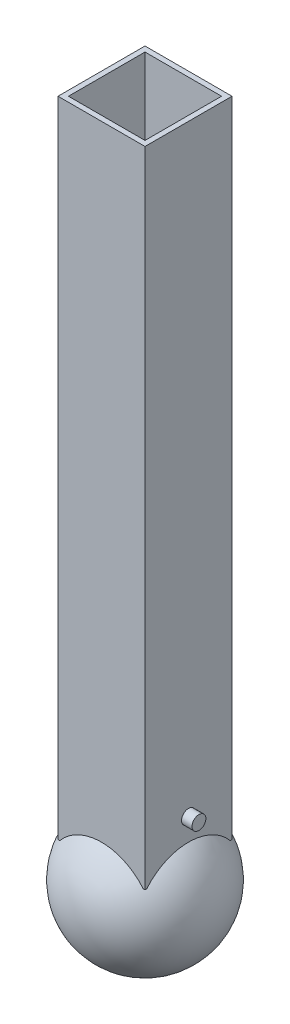
ISO-10303-21;
HEADER;
FILE_DESCRIPTION(('STEP AP214'),'2;1');
FILE_NAME('part.step','',(''),(''),'','','');
FILE_SCHEMA(('AUTOMOTIVE_DESIGN { 1 0 10303 214 1 1 1 1 }'));
ENDSEC;
DATA;
#1=APPLICATION_CONTEXT('core data for automotive mechanical design processes');
#2=APPLICATION_PROTOCOL_DEFINITION('international standard','automotive_design',2000,#1);
#3=PRODUCT_CONTEXT('',#1,'mechanical');
#4=PRODUCT('Part','Part','',(#3));
#5=PRODUCT_RELATED_PRODUCT_CATEGORY('part','',(#4));
#6=PRODUCT_DEFINITION_FORMATION('','',#4);
#7=PRODUCT_DEFINITION_CONTEXT('part definition',#1,'design');
#8=PRODUCT_DEFINITION('design','',#6,#7);
#9=PRODUCT_DEFINITION_SHAPE('','',#8);
#10=(LENGTH_UNIT() NAMED_UNIT(*) SI_UNIT(.MILLI.,.METRE.));
#11=(NAMED_UNIT(*) PLANE_ANGLE_UNIT() SI_UNIT($,.RADIAN.));
#12=(NAMED_UNIT(*) SI_UNIT($,.STERADIAN.) SOLID_ANGLE_UNIT());
#13=UNCERTAINTY_MEASURE_WITH_UNIT(LENGTH_MEASURE(1.E-05),#10,'distance_accuracy_value','');
#14=(GEOMETRIC_REPRESENTATION_CONTEXT(3) GLOBAL_UNCERTAINTY_ASSIGNED_CONTEXT((#13)) GLOBAL_UNIT_ASSIGNED_CONTEXT((#10,
#11,#12)) REPRESENTATION_CONTEXT('',''));
#15=CARTESIAN_POINT('',(0.,0.,0.));
#16=DIRECTION('',(0.,0.,1.));
#17=DIRECTION('',(1.,0.,0.));
#18=AXIS2_PLACEMENT_3D('',#15,#16,#17);
#19=CARTESIAN_POINT('',(15.5,12.,0.));
#20=DIRECTION('',(-1.,0.,0.));
#21=DIRECTION('',(0.,0.,1.));
#22=AXIS2_PLACEMENT_3D('',#19,#20,#21);
#23=CYLINDRICAL_SURFACE('',#22,1.99);
#24=CARTESIAN_POINT('',(15.5,12.,0.));
#25=DIRECTION('',(-1.,0.,0.));
#26=DIRECTION('',(0.,0.,1.));
#27=AXIS2_PLACEMENT_3D('',#24,#25,#26);
#28=CIRCLE('',#27,1.99);
#29=CARTESIAN_POINT('',(15.5,12.,1.99));
#30=VERTEX_POINT('',#29);
#31=EDGE_CURVE('E11',#30,#30,#28,.T.);
#32=ORIENTED_EDGE('',*,*,#31,.T.);
#33=EDGE_LOOP('',(#32));
#34=FACE_BOUND('',#33,.T.);
#35=CARTESIAN_POINT('',(-15.5,12.,0.));
#36=DIRECTION('',(-1.,0.,0.));
#37=DIRECTION('',(0.,0.,1.));
#38=AXIS2_PLACEMENT_3D('',#35,#36,#37);
#39=CIRCLE('',#38,1.99);
#40=CARTESIAN_POINT('',(-15.5,12.,1.99));
#41=VERTEX_POINT('',#40);
#42=EDGE_CURVE('E51',#41,#41,#39,.T.);
#43=ORIENTED_EDGE('',*,*,#42,.F.);
#44=EDGE_LOOP('',(#43));
#45=FACE_BOUND('',#44,.T.);
#46=ADVANCED_FACE('F45',(#34,#45),#23,.T.);
#47=CARTESIAN_POINT('',(15.5,12.,0.));
#48=DIRECTION('',(-1.,0.,0.));
#49=DIRECTION('',(0.,0.,1.));
#50=AXIS2_PLACEMENT_3D('',#47,#48,#49);
#51=PLANE('',#50);
#52=ORIENTED_EDGE('',*,*,#31,.F.);
#53=EDGE_LOOP('',(#52));
#54=FACE_BOUND('',#53,.T.);
#55=ADVANCED_FACE('F60',(#54),#51,.F.);
#56=CARTESIAN_POINT('',(-15.5,12.,0.));
#57=DIRECTION('',(-1.,0.,0.));
#58=DIRECTION('',(0.,0.,1.));
#59=AXIS2_PLACEMENT_3D('',#56,#57,#58);
#60=PLANE('',#59);
#61=ORIENTED_EDGE('',*,*,#42,.T.);
#62=EDGE_LOOP('',(#61));
#63=FACE_BOUND('',#62,.T.);
#64=ADVANCED_FACE('F57',(#63),#60,.T.);
#65=CLOSED_SHELL('',(#46,#55,#64));
#66=MANIFOLD_SOLID_BREP('B2',#65);
#67=CARTESIAN_POINT('',(0.,0.,0.));
#68=DIRECTION('',(0.,1.,0.));
#69=DIRECTION('',(0.,0.,1.));
#70=AXIS2_PLACEMENT_3D('',#67,#68,#69);
#71=PLANE('',#70);
#72=DIRECTION('',(1.,0.,0.));
#73=VECTOR('',#72,1.);
#74=CARTESIAN_POINT('',(-12.5,0.,12.5));
#75=LINE('',#74,#73);
#76=CARTESIAN_POINT('',(11.9895788082818,0.,12.5));
#77=VERTEX_POINT('',#76);
#78=CARTESIAN_POINT('',(12.5,0.,12.5));
#79=VERTEX_POINT('',#78);
#80=EDGE_CURVE('E242',#77,#79,#75,.T.);
#81=ORIENTED_EDGE('',*,*,#80,.F.);
#82=CARTESIAN_POINT('',(0.,0.,0.));
#83=DIRECTION('',(0.,1.,0.));
#84=DIRECTION('',(0.,0.,1.));
#85=AXIS2_PLACEMENT_3D('',#82,#83,#84);
#86=CIRCLE('',#85,17.3205080756888);
#87=CARTESIAN_POINT('',(12.5,0.,11.9895788082818));
#88=VERTEX_POINT('',#87);
#89=EDGE_CURVE('E208',#77,#88,#86,.T.);
#90=ORIENTED_EDGE('',*,*,#89,.T.);
#91=DIRECTION('',(0.,0.,-1.));
#92=VECTOR('',#91,1.);
#93=CARTESIAN_POINT('',(12.5,0.,-12.5));
#94=LINE('',#93,#92);
#95=EDGE_CURVE('E231',#79,#88,#94,.T.);
#96=ORIENTED_EDGE('',*,*,#95,.F.);
#97=EDGE_LOOP('',(#81,#90,#96));
#98=FACE_BOUND('',#97,.T.);
#99=ADVANCED_FACE('F89',(#98),#71,.F.);
#100=CARTESIAN_POINT('',(12.5,0.,-11.9895788082818));
#101=VERTEX_POINT('',#100);
#102=CARTESIAN_POINT('',(12.5,0.,-12.5));
#103=VERTEX_POINT('',#102);
#104=EDGE_CURVE('E219',#101,#103,#94,.T.);
#105=ORIENTED_EDGE('',*,*,#104,.F.);
#106=CARTESIAN_POINT('',(11.9895788082818,0.,-12.5));
#107=VERTEX_POINT('',#106);
#108=EDGE_CURVE('E201',#101,#107,#86,.T.);
#109=ORIENTED_EDGE('',*,*,#108,.T.);
#110=DIRECTION('',(-1.,0.,0.));
#111=VECTOR('',#110,1.);
#112=CARTESIAN_POINT('',(-12.5,0.,-12.5));
#113=LINE('',#112,#111);
#114=EDGE_CURVE('E235',#103,#107,#113,.T.);
#115=ORIENTED_EDGE('',*,*,#114,.F.);
#116=EDGE_LOOP('',(#105,#109,#115));
#117=FACE_BOUND('',#116,.T.);
#118=ADVANCED_FACE('F265',(#117),#71,.F.);
#119=CARTESIAN_POINT('',(-11.9895788082818,0.,-12.5));
#120=VERTEX_POINT('',#119);
#121=CARTESIAN_POINT('',(-12.5,0.,-12.5));
#122=VERTEX_POINT('',#121);
#123=EDGE_CURVE('E234',#120,#122,#113,.T.);
#124=ORIENTED_EDGE('',*,*,#123,.F.);
#125=CARTESIAN_POINT('',(-12.5,0.,-11.9895788082818));
#126=VERTEX_POINT('',#125);
#127=EDGE_CURVE('E270',#120,#126,#86,.T.);
#128=ORIENTED_EDGE('',*,*,#127,.T.);
#129=DIRECTION('',(0.,0.,1.));
#130=VECTOR('',#129,1.);
#131=CARTESIAN_POINT('',(-12.5,0.,-12.5));
#132=LINE('',#131,#130);
#133=EDGE_CURVE('E239',#122,#126,#132,.T.);
#134=ORIENTED_EDGE('',*,*,#133,.F.);
#135=EDGE_LOOP('',(#124,#128,#134));
#136=FACE_BOUND('',#135,.T.);
#137=ADVANCED_FACE('F336',(#136),#71,.F.);
#138=CARTESIAN_POINT('',(12.5,185.,-12.5));
#139=DIRECTION('',(-1.,0.,0.));
#140=DIRECTION('',(0.,0.,1.));
#141=AXIS2_PLACEMENT_3D('',#138,#139,#140);
#142=PLANE('',#141);
#143=CARTESIAN_POINT('',(12.5,12.,0.));
#144=DIRECTION('',(1.,0.,0.));
#145=DIRECTION('',(0.,0.,-1.));
#146=AXIS2_PLACEMENT_3D('',#143,#144,#145);
#147=CIRCLE('',#146,2.);
#148=CARTESIAN_POINT('',(12.5,12.,-2.));
#149=VERTEX_POINT('',#148);
#150=EDGE_CURVE('E309',#149,#149,#147,.T.);
#151=ORIENTED_EDGE('',*,*,#150,.F.);
#152=EDGE_LOOP('',(#151));
#153=FACE_BOUND('',#152,.T.);
#154=ORIENTED_EDGE('',*,*,#95,.T.);
#155=CARTESIAN_POINT('',(12.5,-10.,0.));
#156=DIRECTION('',(-1.,0.,0.));
#157=DIRECTION('',(0.,0.,1.));
#158=AXIS2_PLACEMENT_3D('',#155,#156,#157);
#159=CIRCLE('',#158,15.612494995996);
#160=EDGE_CURVE('E206',#88,#101,#159,.T.);
#161=ORIENTED_EDGE('',*,*,#160,.T.);
#162=ORIENTED_EDGE('',*,*,#104,.T.);
#163=DIRECTION('',(0.,-1.,0.));
#164=VECTOR('',#163,1.);
#165=CARTESIAN_POINT('',(12.5,185.,-12.5));
#166=LINE('',#165,#164);
#167=CARTESIAN_POINT('',(12.5,185.,-12.5));
#168=VERTEX_POINT('',#167);
#169=EDGE_CURVE('E98',#168,#103,#166,.T.);
#170=ORIENTED_EDGE('',*,*,#169,.F.);
#171=DIRECTION('',(0.,0.,-1.));
#172=VECTOR('',#171,1.);
#173=CARTESIAN_POINT('',(12.5,185.,-12.5));
#174=LINE('',#173,#172);
#175=CARTESIAN_POINT('',(12.5,185.,12.5));
#176=VERTEX_POINT('',#175);
#177=EDGE_CURVE('E220',#176,#168,#174,.T.);
#178=ORIENTED_EDGE('',*,*,#177,.F.);
#179=DIRECTION('',(0.,-1.,0.));
#180=VECTOR('',#179,1.);
#181=CARTESIAN_POINT('',(12.5,185.,12.5));
#182=LINE('',#181,#180);
#183=EDGE_CURVE('E230',#176,#79,#182,.T.);
#184=ORIENTED_EDGE('',*,*,#183,.T.);
#185=EDGE_LOOP('',(#154,#161,#162,#170,#178,#184));
#186=FACE_BOUND('',#185,.T.);
#187=ADVANCED_FACE('F91',(#153,#186),#142,.F.);
#188=CARTESIAN_POINT('',(-12.5,185.,-12.5));
#189=DIRECTION('',(0.,0.,1.));
#190=DIRECTION('',(1.,0.,0.));
#191=AXIS2_PLACEMENT_3D('',#188,#189,#190);
#192=PLANE('',#191);
#193=ORIENTED_EDGE('',*,*,#114,.T.);
#194=CARTESIAN_POINT('',(0.,-10.,-12.5));
#195=DIRECTION('',(0.,0.,1.));
#196=DIRECTION('',(1.,0.,0.));
#197=AXIS2_PLACEMENT_3D('',#194,#195,#196);
#198=CIRCLE('',#197,15.612494995996);
#199=EDGE_CURVE('E268',#107,#120,#198,.T.);
#200=ORIENTED_EDGE('',*,*,#199,.T.);
#201=ORIENTED_EDGE('',*,*,#123,.T.);
#202=DIRECTION('',(0.,-1.,0.));
#203=VECTOR('',#202,1.);
#204=CARTESIAN_POINT('',(-12.5,185.,-12.5));
#205=LINE('',#204,#203);
#206=CARTESIAN_POINT('',(-12.5,185.,-12.5));
#207=VERTEX_POINT('',#206);
#208=EDGE_CURVE('E250',#207,#122,#205,.T.);
#209=ORIENTED_EDGE('',*,*,#208,.F.);
#210=DIRECTION('',(-1.,0.,0.));
#211=VECTOR('',#210,1.);
#212=CARTESIAN_POINT('',(-12.5,185.,-12.5));
#213=LINE('',#212,#211);
#214=EDGE_CURVE('E223',#168,#207,#213,.T.);
#215=ORIENTED_EDGE('',*,*,#214,.F.);
#216=ORIENTED_EDGE('',*,*,#169,.T.);
#217=EDGE_LOOP('',(#193,#200,#201,#209,#215,#216));
#218=FACE_BOUND('',#217,.T.);
#219=ADVANCED_FACE('F256',(#218),#192,.F.);
#220=CARTESIAN_POINT('',(-12.5,185.,-12.5));
#221=DIRECTION('',(1.,0.,0.));
#222=DIRECTION('',(0.,0.,-1.));
#223=AXIS2_PLACEMENT_3D('',#220,#221,#222);
#224=PLANE('',#223);
#225=CARTESIAN_POINT('',(-12.5,12.,0.));
#226=DIRECTION('',(1.,0.,0.));
#227=DIRECTION('',(0.,0.,-1.));
#228=AXIS2_PLACEMENT_3D('',#225,#226,#227);
#229=CIRCLE('',#228,2.);
#230=CARTESIAN_POINT('',(-12.5,12.,-2.));
#231=VERTEX_POINT('',#230);
#232=EDGE_CURVE('E312',#231,#231,#229,.T.);
#233=ORIENTED_EDGE('',*,*,#232,.T.);
#234=EDGE_LOOP('',(#233));
#235=FACE_BOUND('',#234,.T.);
#236=ORIENTED_EDGE('',*,*,#133,.T.);
#237=CARTESIAN_POINT('',(-12.5,-10.,0.));
#238=DIRECTION('',(1.,0.,0.));
#239=DIRECTION('',(0.,0.,-1.));
#240=AXIS2_PLACEMENT_3D('',#237,#238,#239);
#241=CIRCLE('',#240,15.612494995996);
#242=CARTESIAN_POINT('',(-12.5,0.,11.9895788082818));
#243=VERTEX_POINT('',#242);
#244=EDGE_CURVE('E275',#126,#243,#241,.T.);
#245=ORIENTED_EDGE('',*,*,#244,.T.);
#246=CARTESIAN_POINT('',(-12.5,0.,12.5));
#247=VERTEX_POINT('',#246);
#248=EDGE_CURVE('E238',#243,#247,#132,.T.);
#249=ORIENTED_EDGE('',*,*,#248,.T.);
#250=DIRECTION('',(0.,-1.,0.));
#251=VECTOR('',#250,1.);
#252=CARTESIAN_POINT('',(-12.5,185.,12.5));
#253=LINE('',#252,#251);
#254=CARTESIAN_POINT('',(-12.5,185.,12.5));
#255=VERTEX_POINT('',#254);
#256=EDGE_CURVE('E247',#255,#247,#253,.T.);
#257=ORIENTED_EDGE('',*,*,#256,.F.);
#258=DIRECTION('',(0.,0.,1.));
#259=VECTOR('',#258,1.);
#260=CARTESIAN_POINT('',(-12.5,185.,-12.5));
#261=LINE('',#260,#259);
#262=EDGE_CURVE('E226',#207,#255,#261,.T.);
#263=ORIENTED_EDGE('',*,*,#262,.F.);
#264=ORIENTED_EDGE('',*,*,#208,.T.);
#265=EDGE_LOOP('',(#236,#245,#249,#257,#263,#264));
#266=FACE_BOUND('',#265,.T.);
#267=ADVANCED_FACE('F354',(#235,#266),#224,.F.);
#268=CARTESIAN_POINT('',(-12.5,185.,12.5));
#269=DIRECTION('',(0.,0.,-1.));
#270=DIRECTION('',(-1.,0.,0.));
#271=AXIS2_PLACEMENT_3D('',#268,#269,#270);
#272=PLANE('',#271);
#273=CARTESIAN_POINT('',(-11.9895788082818,0.,12.5));
#274=VERTEX_POINT('',#273);
#275=EDGE_CURVE('E224',#247,#274,#75,.T.);
#276=ORIENTED_EDGE('',*,*,#275,.T.);
#277=CARTESIAN_POINT('',(0.,-10.,12.5));
#278=DIRECTION('',(0.,0.,-1.));
#279=DIRECTION('',(-1.,0.,0.));
#280=AXIS2_PLACEMENT_3D('',#277,#278,#279);
#281=CIRCLE('',#280,15.612494995996);
#282=EDGE_CURVE('E108',#274,#77,#281,.T.);
#283=ORIENTED_EDGE('',*,*,#282,.T.);
#284=ORIENTED_EDGE('',*,*,#80,.T.);
#285=ORIENTED_EDGE('',*,*,#183,.F.);
#286=DIRECTION('',(1.,0.,0.));
#287=VECTOR('',#286,1.);
#288=CARTESIAN_POINT('',(-12.5,185.,12.5));
#289=LINE('',#288,#287);
#290=EDGE_CURVE('E228',#255,#176,#289,.T.);
#291=ORIENTED_EDGE('',*,*,#290,.F.);
#292=ORIENTED_EDGE('',*,*,#256,.T.);
#293=EDGE_LOOP('',(#276,#283,#284,#285,#291,#292));
#294=FACE_BOUND('',#293,.T.);
#295=ADVANCED_FACE('F291',(#294),#272,.F.);
#296=CARTESIAN_POINT('',(0.,185.,0.));
#297=DIRECTION('',(0.,1.,0.));
#298=DIRECTION('',(0.,0.,1.));
#299=AXIS2_PLACEMENT_3D('',#296,#297,#298);
#300=PLANE('',#299);
#301=DIRECTION('',(0.,0.,-1.));
#302=VECTOR('',#301,1.);
#303=CARTESIAN_POINT('',(11.,185.,0.));
#304=LINE('',#303,#302);
#305=CARTESIAN_POINT('',(11.,185.,11.));
#306=VERTEX_POINT('',#305);
#307=CARTESIAN_POINT('',(11.,185.,-11.));
#308=VERTEX_POINT('',#307);
#309=EDGE_CURVE('E217',#306,#308,#304,.T.);
#310=ORIENTED_EDGE('',*,*,#309,.F.);
#311=DIRECTION('',(1.,0.,0.));
#312=VECTOR('',#311,1.);
#313=CARTESIAN_POINT('',(0.,185.,11.));
#314=LINE('',#313,#312);
#315=CARTESIAN_POINT('',(-11.,185.,11.));
#316=VERTEX_POINT('',#315);
#317=EDGE_CURVE('E199',#316,#306,#314,.T.);
#318=ORIENTED_EDGE('',*,*,#317,.F.);
#319=DIRECTION('',(0.,0.,1.));
#320=VECTOR('',#319,1.);
#321=CARTESIAN_POINT('',(-11.,185.,0.));
#322=LINE('',#321,#320);
#323=CARTESIAN_POINT('',(-11.,185.,-11.));
#324=VERTEX_POINT('',#323);
#325=EDGE_CURVE('E212',#324,#316,#322,.T.);
#326=ORIENTED_EDGE('',*,*,#325,.F.);
#327=DIRECTION('',(-1.,0.,0.));
#328=VECTOR('',#327,1.);
#329=CARTESIAN_POINT('',(0.,185.,-11.));
#330=LINE('',#329,#328);
#331=EDGE_CURVE('E215',#308,#324,#330,.T.);
#332=ORIENTED_EDGE('',*,*,#331,.F.);
#333=EDGE_LOOP('',(#310,#318,#326,#332));
#334=FACE_BOUND('',#333,.T.);
#335=ORIENTED_EDGE('',*,*,#177,.T.);
#336=ORIENTED_EDGE('',*,*,#214,.T.);
#337=ORIENTED_EDGE('',*,*,#262,.T.);
#338=ORIENTED_EDGE('',*,*,#290,.T.);
#339=EDGE_LOOP('',(#335,#336,#337,#338));
#340=FACE_BOUND('',#339,.T.);
#341=ADVANCED_FACE('F287',(#334,#340),#300,.T.);
#342=ORIENTED_EDGE('',*,*,#248,.F.);
#343=EDGE_CURVE('E194',#243,#274,#86,.T.);
#344=ORIENTED_EDGE('',*,*,#343,.T.);
#345=ORIENTED_EDGE('',*,*,#275,.F.);
#346=EDGE_LOOP('',(#342,#344,#345));
#347=FACE_BOUND('',#346,.T.);
#348=ADVANCED_FACE('F290',(#347),#71,.F.);
#349=CARTESIAN_POINT('',(11.,300.,11.));
#350=DIRECTION('',(1.,0.,0.));
#351=DIRECTION('',(0.,0.,-1.));
#352=AXIS2_PLACEMENT_3D('',#349,#350,#351);
#353=PLANE('',#352);
#354=CARTESIAN_POINT('',(11.,12.,0.));
#355=DIRECTION('',(1.,0.,0.));
#356=DIRECTION('',(0.,0.,-1.));
#357=AXIS2_PLACEMENT_3D('',#354,#355,#356);
#358=CIRCLE('',#357,2.);
#359=CARTESIAN_POINT('',(11.,12.,-2.));
#360=VERTEX_POINT('',#359);
#361=EDGE_CURVE('E306',#360,#360,#358,.T.);
#362=ORIENTED_EDGE('',*,*,#361,.T.);
#363=EDGE_LOOP('',(#362));
#364=FACE_BOUND('',#363,.T.);
#365=DIRECTION('',(0.,-1.,0.));
#366=VECTOR('',#365,1.);
#367=CARTESIAN_POINT('',(11.,300.,-11.));
#368=LINE('',#367,#366);
#369=CARTESIAN_POINT('',(11.,2.56980508997654,-11.));
#370=VERTEX_POINT('',#369);
#371=EDGE_CURVE('E193',#308,#370,#368,.T.);
#372=ORIENTED_EDGE('',*,*,#371,.T.);
#373=CARTESIAN_POINT('',(11.,-10.,0.));
#374=DIRECTION('',(1.,0.,0.));
#375=DIRECTION('',(0.,0.,-1.));
#376=AXIS2_PLACEMENT_3D('',#373,#374,#375);
#377=CIRCLE('',#376,16.7032930884901);
#378=CARTESIAN_POINT('',(11.,2.56980508997654,11.));
#379=VERTEX_POINT('',#378);
#380=EDGE_CURVE('E179',#370,#379,#377,.T.);
#381=ORIENTED_EDGE('',*,*,#380,.T.);
#382=DIRECTION('',(0.,-1.,0.));
#383=VECTOR('',#382,1.);
#384=CARTESIAN_POINT('',(11.,300.,11.));
#385=LINE('',#384,#383);
#386=EDGE_CURVE('E190',#306,#379,#385,.T.);
#387=ORIENTED_EDGE('',*,*,#386,.F.);
#388=ORIENTED_EDGE('',*,*,#309,.T.);
#389=EDGE_LOOP('',(#372,#381,#387,#388));
#390=FACE_BOUND('',#389,.T.);
#391=ADVANCED_FACE('F189',(#364,#390),#353,.F.);
#392=CARTESIAN_POINT('',(-11.,300.,-11.));
#393=DIRECTION('',(0.,0.,-1.));
#394=DIRECTION('',(-1.,0.,0.));
#395=AXIS2_PLACEMENT_3D('',#392,#393,#394);
#396=PLANE('',#395);
#397=DIRECTION('',(0.,-1.,0.));
#398=VECTOR('',#397,1.);
#399=CARTESIAN_POINT('',(-11.,300.,-11.));
#400=LINE('',#399,#398);
#401=CARTESIAN_POINT('',(-11.,2.56980508997654,-11.));
#402=VERTEX_POINT('',#401);
#403=EDGE_CURVE('E203',#324,#402,#400,.T.);
#404=ORIENTED_EDGE('',*,*,#403,.T.);
#405=CARTESIAN_POINT('',(0.,-10.,-11.));
#406=DIRECTION('',(0.,0.,-1.));
#407=DIRECTION('',(-1.,0.,0.));
#408=AXIS2_PLACEMENT_3D('',#405,#406,#407);
#409=CIRCLE('',#408,16.7032930884901);
#410=EDGE_CURVE('E195',#402,#370,#409,.T.);
#411=ORIENTED_EDGE('',*,*,#410,.T.);
#412=ORIENTED_EDGE('',*,*,#371,.F.);
#413=ORIENTED_EDGE('',*,*,#331,.T.);
#414=EDGE_LOOP('',(#404,#411,#412,#413));
#415=FACE_BOUND('',#414,.T.);
#416=ADVANCED_FACE('F281',(#415),#396,.F.);
#417=CARTESIAN_POINT('',(-11.,300.,11.));
#418=DIRECTION('',(-1.,0.,0.));
#419=DIRECTION('',(0.,0.,1.));
#420=AXIS2_PLACEMENT_3D('',#417,#418,#419);
#421=PLANE('',#420);
#422=CARTESIAN_POINT('',(-11.,12.,0.));
#423=DIRECTION('',(-1.,0.,0.));
#424=DIRECTION('',(0.,0.,1.));
#425=AXIS2_PLACEMENT_3D('',#422,#423,#424);
#426=CIRCLE('',#425,2.);
#427=CARTESIAN_POINT('',(-11.,12.,2.));
#428=VERTEX_POINT('',#427);
#429=EDGE_CURVE('E93',#428,#428,#426,.T.);
#430=ORIENTED_EDGE('',*,*,#429,.T.);
#431=EDGE_LOOP('',(#430));
#432=FACE_BOUND('',#431,.T.);
#433=DIRECTION('',(0.,-1.,0.));
#434=VECTOR('',#433,1.);
#435=CARTESIAN_POINT('',(-11.,300.,11.));
#436=LINE('',#435,#434);
#437=CARTESIAN_POINT('',(-11.,2.56980508997653,11.));
#438=VERTEX_POINT('',#437);
#439=EDGE_CURVE('E200',#316,#438,#436,.T.);
#440=ORIENTED_EDGE('',*,*,#439,.T.);
#441=CARTESIAN_POINT('',(-11.,-10.,0.));
#442=DIRECTION('',(-1.,0.,0.));
#443=DIRECTION('',(0.,0.,1.));
#444=AXIS2_PLACEMENT_3D('',#441,#442,#443);
#445=CIRCLE('',#444,16.7032930884901);
#446=EDGE_CURVE('E182',#438,#402,#445,.T.);
#447=ORIENTED_EDGE('',*,*,#446,.T.);
#448=ORIENTED_EDGE('',*,*,#403,.F.);
#449=ORIENTED_EDGE('',*,*,#325,.T.);
#450=EDGE_LOOP('',(#440,#447,#448,#449));
#451=FACE_BOUND('',#450,.T.);
#452=ADVANCED_FACE('F285',(#432,#451),#421,.F.);
#453=CARTESIAN_POINT('',(-11.,300.,11.));
#454=DIRECTION('',(0.,0.,1.));
#455=DIRECTION('',(1.,0.,0.));
#456=AXIS2_PLACEMENT_3D('',#453,#454,#455);
#457=PLANE('',#456);
#458=ORIENTED_EDGE('',*,*,#386,.T.);
#459=CARTESIAN_POINT('',(0.,-10.,11.));
#460=DIRECTION('',(0.,0.,1.));
#461=DIRECTION('',(1.,0.,0.));
#462=AXIS2_PLACEMENT_3D('',#459,#460,#461);
#463=CIRCLE('',#462,16.7032930884901);
#464=EDGE_CURVE('E43',#379,#438,#463,.T.);
#465=ORIENTED_EDGE('',*,*,#464,.T.);
#466=ORIENTED_EDGE('',*,*,#439,.F.);
#467=ORIENTED_EDGE('',*,*,#317,.T.);
#468=EDGE_LOOP('',(#458,#465,#466,#467));
#469=FACE_BOUND('',#468,.T.);
#470=ADVANCED_FACE('F197',(#469),#457,.F.);
#471=CARTESIAN_POINT('',(0.,-10.,0.));
#472=DIRECTION('',(0.,0.,-1.));
#473=DIRECTION('',(-1.,0.,0.));
#474=AXIS2_PLACEMENT_3D('',#471,#472,#473);
#475=SPHERICAL_SURFACE('',#474,20.);
#476=CARTESIAN_POINT('',(0.,10.,0.));
#477=VERTEX_POINT('',#476);
#478=VERTEX_LOOP('',#477);
#479=FACE_BOUND('',#478,.T.);
#480=ORIENTED_EDGE('',*,*,#380,.F.);
#481=ORIENTED_EDGE('',*,*,#410,.F.);
#482=ORIENTED_EDGE('',*,*,#446,.F.);
#483=ORIENTED_EDGE('',*,*,#464,.F.);
#484=EDGE_LOOP('',(#480,#481,#482,#483));
#485=FACE_BOUND('',#484,.T.);
#486=ADVANCED_FACE('F178',(#479,#485),#475,.T.);
#487=ORIENTED_EDGE('',*,*,#108,.F.);
#488=ORIENTED_EDGE('',*,*,#160,.F.);
#489=ORIENTED_EDGE('',*,*,#89,.F.);
#490=ORIENTED_EDGE('',*,*,#282,.F.);
#491=ORIENTED_EDGE('',*,*,#343,.F.);
#492=ORIENTED_EDGE('',*,*,#244,.F.);
#493=ORIENTED_EDGE('',*,*,#127,.F.);
#494=ORIENTED_EDGE('',*,*,#199,.F.);
#495=EDGE_LOOP('',(#487,#488,#489,#490,#491,#492,#493,#494));
#496=FACE_BOUND('',#495,.T.);
#497=ADVANCED_FACE('F266',(#496),#475,.T.);
#498=CARTESIAN_POINT('',(-12.5,12.,0.));
#499=DIRECTION('',(1.,0.,0.));
#500=DIRECTION('',(0.,0.,-1.));
#501=AXIS2_PLACEMENT_3D('',#498,#499,#500);
#502=CYLINDRICAL_SURFACE('',#501,2.);
#503=ORIENTED_EDGE('',*,*,#232,.F.);
#504=EDGE_LOOP('',(#503));
#505=FACE_BOUND('',#504,.T.);
#506=ORIENTED_EDGE('',*,*,#429,.F.);
#507=EDGE_LOOP('',(#506));
#508=FACE_BOUND('',#507,.T.);
#509=ADVANCED_FACE('F320',(#505,#508),#502,.F.);
#510=ORIENTED_EDGE('',*,*,#150,.T.);
#511=EDGE_LOOP('',(#510));
#512=FACE_BOUND('',#511,.T.);
#513=ORIENTED_EDGE('',*,*,#361,.F.);
#514=EDGE_LOOP('',(#513));
#515=FACE_BOUND('',#514,.T.);
#516=ADVANCED_FACE('F322',(#512,#515),#502,.F.);
#517=CLOSED_SHELL('',(#99,#118,#137,#187,#219,#267,#295,#341,#348,#391,#416,#452,#470,#486,#497,
#509,#516));
#518=MANIFOLD_SOLID_BREP('B6',#517);
#519=ADVANCED_BREP_SHAPE_REPRESENTATION('',(#18,#66,#518),#14);
#520=SHAPE_DEFINITION_REPRESENTATION(#9,#519);
ENDSEC;
END-ISO-10303-21;
